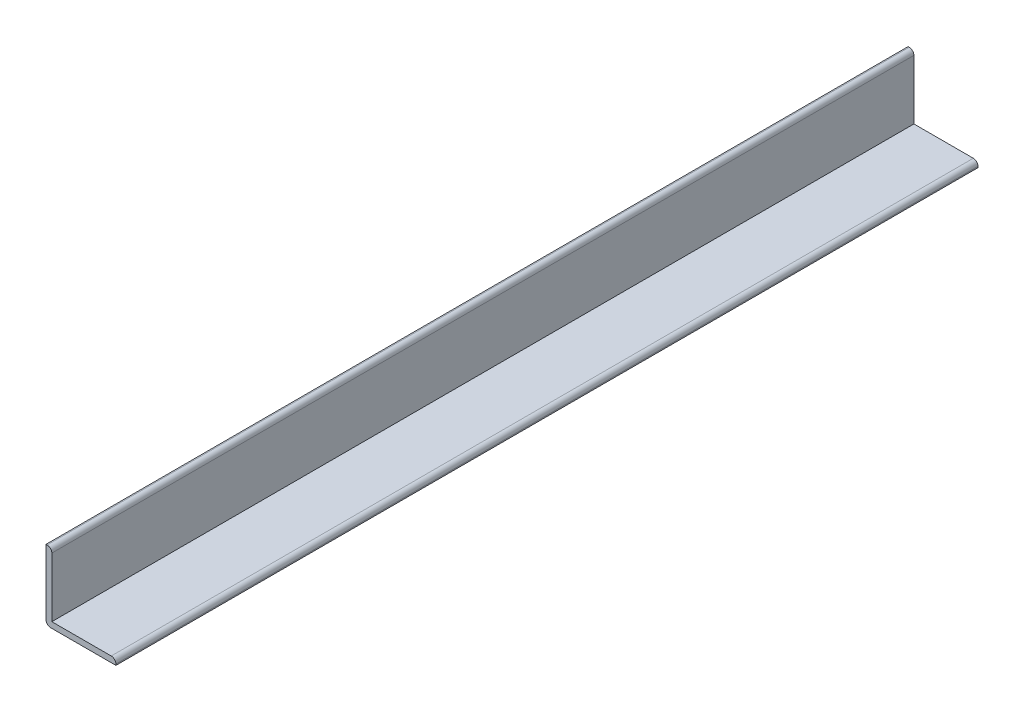
ISO-10303-21;
HEADER;
FILE_DESCRIPTION(('STEP AP214'),'2;1');
FILE_NAME('part.step','',(''),(''),'','','');
FILE_SCHEMA(('AUTOMOTIVE_DESIGN { 1 0 10303 214 1 1 1 1 }'));
ENDSEC;
DATA;
#1=APPLICATION_CONTEXT('core data for automotive mechanical design processes');
#2=APPLICATION_PROTOCOL_DEFINITION('international standard','automotive_design',2000,#1);
#3=PRODUCT_CONTEXT('',#1,'mechanical');
#4=PRODUCT('Part','Part','',(#3));
#5=PRODUCT_RELATED_PRODUCT_CATEGORY('part','',(#4));
#6=PRODUCT_DEFINITION_FORMATION('','',#4);
#7=PRODUCT_DEFINITION_CONTEXT('part definition',#1,'design');
#8=PRODUCT_DEFINITION('design','',#6,#7);
#9=PRODUCT_DEFINITION_SHAPE('','',#8);
#10=(LENGTH_UNIT() NAMED_UNIT(*) SI_UNIT(.MILLI.,.METRE.));
#11=(NAMED_UNIT(*) PLANE_ANGLE_UNIT() SI_UNIT($,.RADIAN.));
#12=(NAMED_UNIT(*) SI_UNIT($,.STERADIAN.) SOLID_ANGLE_UNIT());
#13=UNCERTAINTY_MEASURE_WITH_UNIT(LENGTH_MEASURE(1.E-05),#10,'distance_accuracy_value','');
#14=(GEOMETRIC_REPRESENTATION_CONTEXT(3) GLOBAL_UNCERTAINTY_ASSIGNED_CONTEXT((#13)) GLOBAL_UNIT_ASSIGNED_CONTEXT((#10,
#11,#12)) REPRESENTATION_CONTEXT('',''));
#15=CARTESIAN_POINT('',(0.,0.,0.));
#16=DIRECTION('',(0.,0.,1.));
#17=DIRECTION('',(1.,0.,0.));
#18=AXIS2_PLACEMENT_3D('',#15,#16,#17);
#19=CARTESIAN_POINT('',(0.,38.1,469.9));
#20=DIRECTION('',(0.,-1.,0.));
#21=DIRECTION('',(0.,0.,-1.));
#22=AXIS2_PLACEMENT_3D('',#19,#20,#21);
#23=PLANE('',#22);
#24=DIRECTION('',(-1.,0.,0.));
#25=VECTOR('',#24,1.);
#26=CARTESIAN_POINT('',(0.,38.1,0.));
#27=LINE('',#26,#25);
#28=CARTESIAN_POINT('',(0.634999999999982,38.1,0.));
#29=VERTEX_POINT('',#28);
#30=CARTESIAN_POINT('',(0.,38.1,0.));
#31=VERTEX_POINT('',#30);
#32=EDGE_CURVE('E146',#29,#31,#27,.T.);
#33=ORIENTED_EDGE('',*,*,#32,.T.);
#34=DIRECTION('',(0.,0.,-1.));
#35=VECTOR('',#34,1.);
#36=CARTESIAN_POINT('',(0.,38.1,469.9));
#37=LINE('',#36,#35);
#38=CARTESIAN_POINT('',(0.,38.1,469.9));
#39=VERTEX_POINT('',#38);
#40=EDGE_CURVE('E11',#39,#31,#37,.T.);
#41=ORIENTED_EDGE('',*,*,#40,.F.);
#42=DIRECTION('',(-1.,0.,0.));
#43=VECTOR('',#42,1.);
#44=CARTESIAN_POINT('',(0.,38.1,469.9));
#45=LINE('',#44,#43);
#46=CARTESIAN_POINT('',(0.634999999999982,38.1,469.9));
#47=VERTEX_POINT('',#46);
#48=EDGE_CURVE('E171',#47,#39,#45,.T.);
#49=ORIENTED_EDGE('',*,*,#48,.F.);
#50=DIRECTION('',(0.,0.,-1.));
#51=VECTOR('',#50,1.);
#52=CARTESIAN_POINT('',(0.634999999999982,38.1,469.9));
#53=LINE('',#52,#51);
#54=EDGE_CURVE('E142',#47,#29,#53,.T.);
#55=ORIENTED_EDGE('',*,*,#54,.T.);
#56=EDGE_LOOP('',(#33,#41,#49,#55));
#57=FACE_BOUND('',#56,.T.);
#58=ADVANCED_FACE('F39',(#57),#23,.F.);
#59=CARTESIAN_POINT('',(0.,2.54000000000002,469.9));
#60=DIRECTION('',(1.,0.,0.));
#61=DIRECTION('',(0.,0.,-1.));
#62=AXIS2_PLACEMENT_3D('',#59,#60,#61);
#63=PLANE('',#62);
#64=DIRECTION('',(0.,-1.,0.));
#65=VECTOR('',#64,1.);
#66=CARTESIAN_POINT('',(0.,2.54000000000002,0.));
#67=LINE('',#66,#65);
#68=CARTESIAN_POINT('',(0.,2.54000000000002,0.));
#69=VERTEX_POINT('',#68);
#70=EDGE_CURVE('E150',#31,#69,#67,.T.);
#71=ORIENTED_EDGE('',*,*,#70,.T.);
#72=DIRECTION('',(0.,0.,-1.));
#73=VECTOR('',#72,1.);
#74=CARTESIAN_POINT('',(0.,2.54000000000002,469.9));
#75=LINE('',#74,#73);
#76=CARTESIAN_POINT('',(0.,2.54000000000002,469.9));
#77=VERTEX_POINT('',#76);
#78=EDGE_CURVE('E48',#77,#69,#75,.T.);
#79=ORIENTED_EDGE('',*,*,#78,.F.);
#80=DIRECTION('',(0.,-1.,0.));
#81=VECTOR('',#80,1.);
#82=CARTESIAN_POINT('',(0.,2.54000000000002,469.9));
#83=LINE('',#82,#81);
#84=EDGE_CURVE('E102',#39,#77,#83,.T.);
#85=ORIENTED_EDGE('',*,*,#84,.F.);
#86=ORIENTED_EDGE('',*,*,#40,.T.);
#87=EDGE_LOOP('',(#71,#79,#85,#86));
#88=FACE_BOUND('',#87,.T.);
#89=ADVANCED_FACE('F227',(#88),#63,.F.);
#90=CARTESIAN_POINT('',(2.54,2.54,469.9));
#91=DIRECTION('',(0.,0.,-1.));
#92=DIRECTION('',(-1.,0.,0.));
#93=AXIS2_PLACEMENT_3D('',#90,#91,#92);
#94=CYLINDRICAL_SURFACE('',#93,2.54);
#95=CARTESIAN_POINT('',(2.54,2.54,0.));
#96=DIRECTION('',(0.,0.,1.));
#97=DIRECTION('',(-1.,0.,0.));
#98=AXIS2_PLACEMENT_3D('',#95,#96,#97);
#99=CIRCLE('',#98,2.54);
#100=CARTESIAN_POINT('',(2.54000000000002,0.,0.));
#101=VERTEX_POINT('',#100);
#102=EDGE_CURVE('E153',#69,#101,#99,.T.);
#103=ORIENTED_EDGE('',*,*,#102,.T.);
#104=DIRECTION('',(0.,0.,-1.));
#105=VECTOR('',#104,1.);
#106=CARTESIAN_POINT('',(2.54000000000002,0.,469.9));
#107=LINE('',#106,#105);
#108=CARTESIAN_POINT('',(2.54000000000002,0.,469.9));
#109=VERTEX_POINT('',#108);
#110=EDGE_CURVE('E186',#109,#101,#107,.T.);
#111=ORIENTED_EDGE('',*,*,#110,.F.);
#112=CARTESIAN_POINT('',(2.54,2.54,469.9));
#113=DIRECTION('',(0.,0.,1.));
#114=DIRECTION('',(-1.,0.,0.));
#115=AXIS2_PLACEMENT_3D('',#112,#113,#114);
#116=CIRCLE('',#115,2.54);
#117=EDGE_CURVE('E196',#77,#109,#116,.T.);
#118=ORIENTED_EDGE('',*,*,#117,.F.);
#119=ORIENTED_EDGE('',*,*,#78,.T.);
#120=EDGE_LOOP('',(#103,#111,#118,#119));
#121=FACE_BOUND('',#120,.T.);
#122=ADVANCED_FACE('F194',(#121),#94,.T.);
#123=CARTESIAN_POINT('',(38.1,0.,469.9));
#124=DIRECTION('',(0.,1.,0.));
#125=DIRECTION('',(-1.,0.,0.));
#126=AXIS2_PLACEMENT_3D('',#123,#124,#125);
#127=PLANE('',#126);
#128=DIRECTION('',(1.,0.,0.));
#129=VECTOR('',#128,1.);
#130=CARTESIAN_POINT('',(38.1,0.,0.));
#131=LINE('',#130,#129);
#132=CARTESIAN_POINT('',(38.1,0.,0.));
#133=VERTEX_POINT('',#132);
#134=EDGE_CURVE('E156',#101,#133,#131,.T.);
#135=ORIENTED_EDGE('',*,*,#134,.T.);
#136=DIRECTION('',(0.,0.,-1.));
#137=VECTOR('',#136,1.);
#138=CARTESIAN_POINT('',(38.1,0.,469.9));
#139=LINE('',#138,#137);
#140=CARTESIAN_POINT('',(38.1,0.,469.9));
#141=VERTEX_POINT('',#140);
#142=EDGE_CURVE('E182',#141,#133,#139,.T.);
#143=ORIENTED_EDGE('',*,*,#142,.F.);
#144=DIRECTION('',(1.,0.,0.));
#145=VECTOR('',#144,1.);
#146=CARTESIAN_POINT('',(38.1,0.,469.9));
#147=LINE('',#146,#145);
#148=EDGE_CURVE('E213',#109,#141,#147,.T.);
#149=ORIENTED_EDGE('',*,*,#148,.F.);
#150=ORIENTED_EDGE('',*,*,#110,.T.);
#151=EDGE_LOOP('',(#135,#143,#149,#150));
#152=FACE_BOUND('',#151,.T.);
#153=ADVANCED_FACE('F205',(#152),#127,.F.);
#154=CARTESIAN_POINT('',(38.1,0.634999999999982,469.9));
#155=DIRECTION('',(-1.,0.,0.));
#156=DIRECTION('',(0.,0.,1.));
#157=AXIS2_PLACEMENT_3D('',#154,#155,#156);
#158=PLANE('',#157);
#159=DIRECTION('',(0.,1.,0.));
#160=VECTOR('',#159,1.);
#161=CARTESIAN_POINT('',(38.1,0.634999999999982,0.));
#162=LINE('',#161,#160);
#163=CARTESIAN_POINT('',(38.1,0.634999999999982,0.));
#164=VERTEX_POINT('',#163);
#165=EDGE_CURVE('E159',#133,#164,#162,.T.);
#166=ORIENTED_EDGE('',*,*,#165,.T.);
#167=DIRECTION('',(0.,0.,-1.));
#168=VECTOR('',#167,1.);
#169=CARTESIAN_POINT('',(38.1,0.634999999999982,469.9));
#170=LINE('',#169,#168);
#171=CARTESIAN_POINT('',(38.1,0.634999999999982,469.9));
#172=VERTEX_POINT('',#171);
#173=EDGE_CURVE('E178',#172,#164,#170,.T.);
#174=ORIENTED_EDGE('',*,*,#173,.F.);
#175=DIRECTION('',(0.,1.,0.));
#176=VECTOR('',#175,1.);
#177=CARTESIAN_POINT('',(38.1,0.634999999999982,469.9));
#178=LINE('',#177,#176);
#179=EDGE_CURVE('E211',#141,#172,#178,.T.);
#180=ORIENTED_EDGE('',*,*,#179,.F.);
#181=ORIENTED_EDGE('',*,*,#142,.T.);
#182=EDGE_LOOP('',(#166,#174,#180,#181));
#183=FACE_BOUND('',#182,.T.);
#184=ADVANCED_FACE('F209',(#183),#158,.F.);
#185=CARTESIAN_POINT('',(35.56,0.635000000000001,469.9));
#186=DIRECTION('',(0.,0.,-1.));
#187=DIRECTION('',(-1.,0.,0.));
#188=AXIS2_PLACEMENT_3D('',#185,#186,#187);
#189=CYLINDRICAL_SURFACE('',#188,2.54);
#190=CARTESIAN_POINT('',(35.56,0.635000000000001,0.));
#191=DIRECTION('',(0.,0.,1.));
#192=DIRECTION('',(1.,0.,0.));
#193=AXIS2_PLACEMENT_3D('',#190,#191,#192);
#194=CIRCLE('',#193,2.54);
#195=CARTESIAN_POINT('',(35.56,3.175,0.));
#196=VERTEX_POINT('',#195);
#197=EDGE_CURVE('E162',#164,#196,#194,.T.);
#198=ORIENTED_EDGE('',*,*,#197,.T.);
#199=DIRECTION('',(0.,0.,-1.));
#200=VECTOR('',#199,1.);
#201=CARTESIAN_POINT('',(35.56,3.175,469.9));
#202=LINE('',#201,#200);
#203=CARTESIAN_POINT('',(35.56,3.175,469.9));
#204=VERTEX_POINT('',#203);
#205=EDGE_CURVE('E135',#204,#196,#202,.T.);
#206=ORIENTED_EDGE('',*,*,#205,.F.);
#207=CARTESIAN_POINT('',(35.56,0.635000000000001,469.9));
#208=DIRECTION('',(0.,0.,1.));
#209=DIRECTION('',(1.,0.,0.));
#210=AXIS2_PLACEMENT_3D('',#207,#208,#209);
#211=CIRCLE('',#210,2.54);
#212=EDGE_CURVE('E124',#172,#204,#211,.T.);
#213=ORIENTED_EDGE('',*,*,#212,.F.);
#214=ORIENTED_EDGE('',*,*,#173,.T.);
#215=EDGE_LOOP('',(#198,#206,#213,#214));
#216=FACE_BOUND('',#215,.T.);
#217=ADVANCED_FACE('F239',(#216),#189,.T.);
#218=CARTESIAN_POINT('',(3.175,3.175,469.9));
#219=DIRECTION('',(0.,-1.,0.));
#220=DIRECTION('',(0.,0.,-1.));
#221=AXIS2_PLACEMENT_3D('',#218,#219,#220);
#222=PLANE('',#221);
#223=DIRECTION('',(-1.,0.,0.));
#224=VECTOR('',#223,1.);
#225=CARTESIAN_POINT('',(3.175,3.175,0.));
#226=LINE('',#225,#224);
#227=CARTESIAN_POINT('',(3.175,3.175,0.));
#228=VERTEX_POINT('',#227);
#229=EDGE_CURVE('E133',#196,#228,#226,.T.);
#230=ORIENTED_EDGE('',*,*,#229,.T.);
#231=DIRECTION('',(0.,0.,-1.));
#232=VECTOR('',#231,1.);
#233=CARTESIAN_POINT('',(3.175,3.175,469.9));
#234=LINE('',#233,#232);
#235=CARTESIAN_POINT('',(3.175,3.175,469.9));
#236=VERTEX_POINT('',#235);
#237=EDGE_CURVE('E130',#236,#228,#234,.T.);
#238=ORIENTED_EDGE('',*,*,#237,.F.);
#239=DIRECTION('',(-1.,0.,0.));
#240=VECTOR('',#239,1.);
#241=CARTESIAN_POINT('',(3.175,3.175,469.9));
#242=LINE('',#241,#240);
#243=EDGE_CURVE('E118',#204,#236,#242,.T.);
#244=ORIENTED_EDGE('',*,*,#243,.F.);
#245=ORIENTED_EDGE('',*,*,#205,.T.);
#246=EDGE_LOOP('',(#230,#238,#244,#245));
#247=FACE_BOUND('',#246,.T.);
#248=ADVANCED_FACE('F131',(#247),#222,.F.);
#249=CARTESIAN_POINT('',(3.175,35.56,469.9));
#250=DIRECTION('',(-1.,0.,0.));
#251=DIRECTION('',(0.,-1.,0.));
#252=AXIS2_PLACEMENT_3D('',#249,#250,#251);
#253=PLANE('',#252);
#254=DIRECTION('',(0.,1.,0.));
#255=VECTOR('',#254,1.);
#256=CARTESIAN_POINT('',(3.175,35.56,0.));
#257=LINE('',#256,#255);
#258=CARTESIAN_POINT('',(3.175,35.56,0.));
#259=VERTEX_POINT('',#258);
#260=EDGE_CURVE('E88',#228,#259,#257,.T.);
#261=ORIENTED_EDGE('',*,*,#260,.T.);
#262=DIRECTION('',(0.,0.,-1.));
#263=VECTOR('',#262,1.);
#264=CARTESIAN_POINT('',(3.175,35.56,469.9));
#265=LINE('',#264,#263);
#266=CARTESIAN_POINT('',(3.175,35.56,469.9));
#267=VERTEX_POINT('',#266);
#268=EDGE_CURVE('E136',#267,#259,#265,.T.);
#269=ORIENTED_EDGE('',*,*,#268,.F.);
#270=DIRECTION('',(0.,1.,0.));
#271=VECTOR('',#270,1.);
#272=CARTESIAN_POINT('',(3.175,35.56,469.9));
#273=LINE('',#272,#271);
#274=EDGE_CURVE('E122',#236,#267,#273,.T.);
#275=ORIENTED_EDGE('',*,*,#274,.F.);
#276=ORIENTED_EDGE('',*,*,#237,.T.);
#277=EDGE_LOOP('',(#261,#269,#275,#276));
#278=FACE_BOUND('',#277,.T.);
#279=ADVANCED_FACE('F138',(#278),#253,.F.);
#280=CARTESIAN_POINT('',(0.635,35.56,469.9));
#281=DIRECTION('',(0.,0.,-1.));
#282=DIRECTION('',(-1.,0.,0.));
#283=AXIS2_PLACEMENT_3D('',#280,#281,#282);
#284=CYLINDRICAL_SURFACE('',#283,2.54);
#285=CARTESIAN_POINT('',(0.635,35.56,0.));
#286=DIRECTION('',(0.,0.,1.));
#287=DIRECTION('',(1.,0.,0.));
#288=AXIS2_PLACEMENT_3D('',#285,#286,#287);
#289=CIRCLE('',#288,2.54);
#290=EDGE_CURVE('E94',#259,#29,#289,.T.);
#291=ORIENTED_EDGE('',*,*,#290,.T.);
#292=ORIENTED_EDGE('',*,*,#54,.F.);
#293=CARTESIAN_POINT('',(0.635,35.56,469.9));
#294=DIRECTION('',(0.,0.,1.));
#295=DIRECTION('',(1.,0.,0.));
#296=AXIS2_PLACEMENT_3D('',#293,#294,#295);
#297=CIRCLE('',#296,2.54);
#298=EDGE_CURVE('E56',#267,#47,#297,.T.);
#299=ORIENTED_EDGE('',*,*,#298,.F.);
#300=ORIENTED_EDGE('',*,*,#268,.T.);
#301=EDGE_LOOP('',(#291,#292,#299,#300));
#302=FACE_BOUND('',#301,.T.);
#303=ADVANCED_FACE('F247',(#302),#284,.T.);
#304=CARTESIAN_POINT('',(0.635,35.56,469.9));
#305=DIRECTION('',(0.,0.,1.));
#306=DIRECTION('',(1.,0.,0.));
#307=AXIS2_PLACEMENT_3D('',#304,#305,#306);
#308=PLANE('',#307);
#309=ORIENTED_EDGE('',*,*,#48,.T.);
#310=ORIENTED_EDGE('',*,*,#84,.T.);
#311=ORIENTED_EDGE('',*,*,#117,.T.);
#312=ORIENTED_EDGE('',*,*,#148,.T.);
#313=ORIENTED_EDGE('',*,*,#179,.T.);
#314=ORIENTED_EDGE('',*,*,#212,.T.);
#315=ORIENTED_EDGE('',*,*,#243,.T.);
#316=ORIENTED_EDGE('',*,*,#274,.T.);
#317=ORIENTED_EDGE('',*,*,#298,.T.);
#318=EDGE_LOOP('',(#309,#310,#311,#312,#313,#314,#315,#316,#317));
#319=FACE_BOUND('',#318,.T.);
#320=ADVANCED_FACE('F120',(#319),#308,.T.);
#321=CARTESIAN_POINT('',(0.635,35.56,0.));
#322=DIRECTION('',(0.,0.,1.));
#323=DIRECTION('',(1.,0.,0.));
#324=AXIS2_PLACEMENT_3D('',#321,#322,#323);
#325=PLANE('',#324);
#326=ORIENTED_EDGE('',*,*,#32,.F.);
#327=ORIENTED_EDGE('',*,*,#290,.F.);
#328=ORIENTED_EDGE('',*,*,#260,.F.);
#329=ORIENTED_EDGE('',*,*,#229,.F.);
#330=ORIENTED_EDGE('',*,*,#197,.F.);
#331=ORIENTED_EDGE('',*,*,#165,.F.);
#332=ORIENTED_EDGE('',*,*,#134,.F.);
#333=ORIENTED_EDGE('',*,*,#102,.F.);
#334=ORIENTED_EDGE('',*,*,#70,.F.);
#335=EDGE_LOOP('',(#326,#327,#328,#329,#330,#331,#332,#333,#334));
#336=FACE_BOUND('',#335,.T.);
#337=ADVANCED_FACE('F200',(#336),#325,.F.);
#338=CLOSED_SHELL('',(#58,#89,#122,#153,#184,#217,#248,#279,#303,#320,#337));
#339=MANIFOLD_SOLID_BREP('B2',#338);
#340=ADVANCED_BREP_SHAPE_REPRESENTATION('',(#18,#339),#14);
#341=SHAPE_DEFINITION_REPRESENTATION(#9,#340);
ENDSEC;
END-ISO-10303-21;
